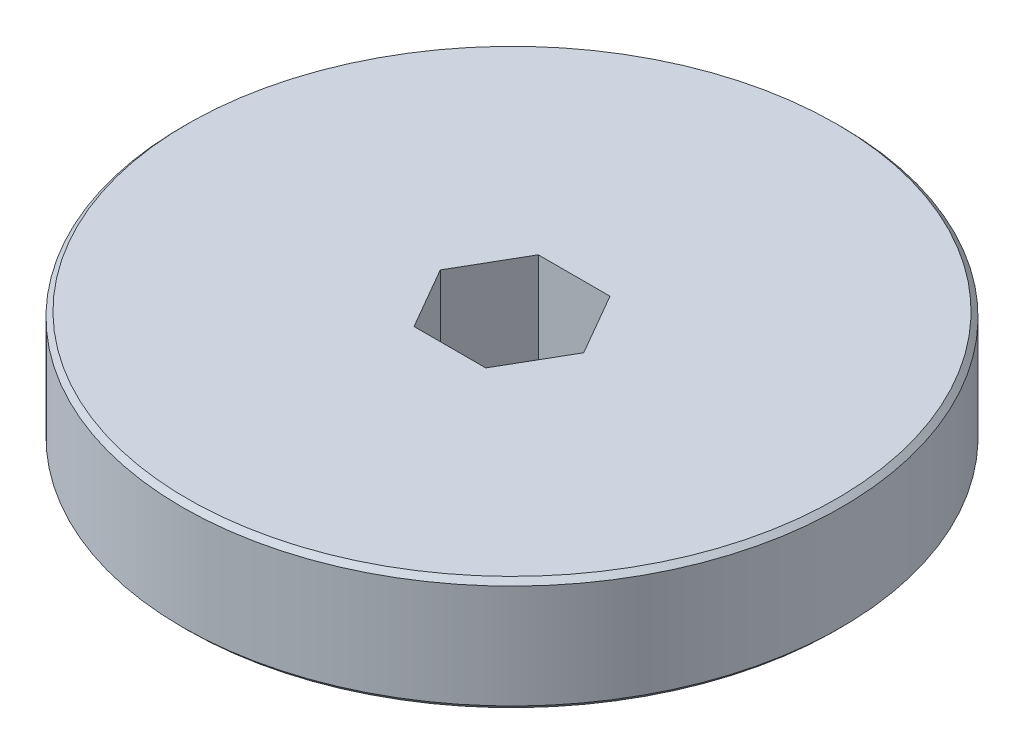
ISO-10303-21;
HEADER;
FILE_DESCRIPTION(('STEP AP214'),'2;1');
FILE_NAME('part.step','',(''),(''),'','','');
FILE_SCHEMA(('AUTOMOTIVE_DESIGN { 1 0 10303 214 1 1 1 1 }'));
ENDSEC;
DATA;
#1=APPLICATION_CONTEXT('core data for automotive mechanical design processes');
#2=APPLICATION_PROTOCOL_DEFINITION('international standard','automotive_design',2000,#1);
#3=PRODUCT_CONTEXT('',#1,'mechanical');
#4=PRODUCT('Part','Part','',(#3));
#5=PRODUCT_RELATED_PRODUCT_CATEGORY('part','',(#4));
#6=PRODUCT_DEFINITION_FORMATION('','',#4);
#7=PRODUCT_DEFINITION_CONTEXT('part definition',#1,'design');
#8=PRODUCT_DEFINITION('design','',#6,#7);
#9=PRODUCT_DEFINITION_SHAPE('','',#8);
#10=(LENGTH_UNIT() NAMED_UNIT(*) SI_UNIT(.MILLI.,.METRE.));
#11=(NAMED_UNIT(*) PLANE_ANGLE_UNIT() SI_UNIT($,.RADIAN.));
#12=(NAMED_UNIT(*) SI_UNIT($,.STERADIAN.) SOLID_ANGLE_UNIT());
#13=UNCERTAINTY_MEASURE_WITH_UNIT(LENGTH_MEASURE(1.E-05),#10,'distance_accuracy_value','');
#14=(GEOMETRIC_REPRESENTATION_CONTEXT(3) GLOBAL_UNCERTAINTY_ASSIGNED_CONTEXT((#13)) GLOBAL_UNIT_ASSIGNED_CONTEXT((#10,
#11,#12)) REPRESENTATION_CONTEXT('',''));
#15=CARTESIAN_POINT('',(0.,0.,0.));
#16=DIRECTION('',(0.,0.,1.));
#17=DIRECTION('',(1.,0.,0.));
#18=AXIS2_PLACEMENT_3D('',#15,#16,#17);
#19=CARTESIAN_POINT('',(0.,-0.381,0.));
#20=DIRECTION('',(0.,-1.,0.));
#21=DIRECTION('',(0.,0.,-1.));
#22=AXIS2_PLACEMENT_3D('',#19,#20,#21);
#23=CONICAL_SURFACE('',#22,25.4,0.785398163397447);
#24=CARTESIAN_POINT('',(0.,0.,0.));
#25=DIRECTION('',(0.,-1.,0.));
#26=DIRECTION('',(0.,0.,-1.));
#27=AXIS2_PLACEMENT_3D('',#24,#25,#26);
#28=CIRCLE('',#27,25.019);
#29=CARTESIAN_POINT('',(0.,0.,-25.019));
#30=VERTEX_POINT('',#29);
#31=EDGE_CURVE('E20',#30,#30,#28,.F.);
#32=ORIENTED_EDGE('',*,*,#31,.F.);
#33=EDGE_LOOP('',(#32));
#34=FACE_BOUND('',#33,.T.);
#35=CARTESIAN_POINT('',(0.,-0.380999999999999,0.));
#36=DIRECTION('',(0.,-1.,0.));
#37=DIRECTION('',(0.,0.,-1.));
#38=AXIS2_PLACEMENT_3D('',#35,#36,#37);
#39=CIRCLE('',#38,25.4);
#40=CARTESIAN_POINT('',(0.,-0.380999999999999,-25.4));
#41=VERTEX_POINT('',#40);
#42=EDGE_CURVE('E103',#41,#41,#39,.T.);
#43=ORIENTED_EDGE('',*,*,#42,.F.);
#44=EDGE_LOOP('',(#43));
#45=FACE_BOUND('',#44,.T.);
#46=ADVANCED_FACE('F17',(#34,#45),#23,.T.);
#47=CARTESIAN_POINT('',(0.,-8.763,0.));
#48=DIRECTION('',(0.,-1.,0.));
#49=DIRECTION('',(0.,0.,-1.));
#50=AXIS2_PLACEMENT_3D('',#47,#48,#49);
#51=CYLINDRICAL_SURFACE('',#50,25.4);
#52=CARTESIAN_POINT('',(0.,-8.382,0.));
#53=DIRECTION('',(0.,1.,0.));
#54=DIRECTION('',(0.,0.,1.));
#55=AXIS2_PLACEMENT_3D('',#52,#53,#54);
#56=CIRCLE('',#55,25.4);
#57=CARTESIAN_POINT('',(0.,-8.382,25.4));
#58=VERTEX_POINT('',#57);
#59=EDGE_CURVE('E90',#58,#58,#56,.F.);
#60=ORIENTED_EDGE('',*,*,#59,.F.);
#61=EDGE_LOOP('',(#60));
#62=FACE_BOUND('',#61,.T.);
#63=ORIENTED_EDGE('',*,*,#42,.T.);
#64=EDGE_LOOP('',(#63));
#65=FACE_BOUND('',#64,.T.);
#66=ADVANCED_FACE('F207',(#62,#65),#51,.T.);
#67=CARTESIAN_POINT('',(0.,0.,0.));
#68=DIRECTION('',(0.,1.,0.));
#69=DIRECTION('',(0.,0.,1.));
#70=AXIS2_PLACEMENT_3D('',#67,#68,#69);
#71=PLANE('',#70);
#72=DIRECTION('',(0.499999999999999,0.,0.866025403784439));
#73=VECTOR('',#72,1.);
#74=CARTESIAN_POINT('',(5.52859070770601,0.,0.));
#75=LINE('',#74,#73);
#76=CARTESIAN_POINT('',(5.52859070770601,0.,0.));
#77=VERTEX_POINT('',#76);
#78=CARTESIAN_POINT('',(2.764295353853,0.,-4.78789999999999));
#79=VERTEX_POINT('',#78);
#80=EDGE_CURVE('E66',#77,#79,#75,.F.);
#81=ORIENTED_EDGE('',*,*,#80,.F.);
#82=DIRECTION('',(-0.5,0.,0.866025403784439));
#83=VECTOR('',#82,1.);
#84=CARTESIAN_POINT('',(2.764295353853,0.,4.78790000000001));
#85=LINE('',#84,#83);
#86=CARTESIAN_POINT('',(2.764295353853,0.,4.78790000000001));
#87=VERTEX_POINT('',#86);
#88=EDGE_CURVE('E125',#87,#77,#85,.F.);
#89=ORIENTED_EDGE('',*,*,#88,.F.);
#90=DIRECTION('',(-1.,0.,0.));
#91=VECTOR('',#90,1.);
#92=CARTESIAN_POINT('',(-2.76429535385301,0.,4.78790000000001));
#93=LINE('',#92,#91);
#94=CARTESIAN_POINT('',(-2.76429535385301,0.,4.78790000000001));
#95=VERTEX_POINT('',#94);
#96=EDGE_CURVE('E121',#95,#87,#93,.F.);
#97=ORIENTED_EDGE('',*,*,#96,.F.);
#98=DIRECTION('',(-0.5,0.,-0.866025403784439));
#99=VECTOR('',#98,1.);
#100=CARTESIAN_POINT('',(-5.52859070770602,0.,0.));
#101=LINE('',#100,#99);
#102=CARTESIAN_POINT('',(-5.52859070770602,0.,0.));
#103=VERTEX_POINT('',#102);
#104=EDGE_CURVE('E86',#103,#95,#101,.F.);
#105=ORIENTED_EDGE('',*,*,#104,.F.);
#106=DIRECTION('',(0.5,0.,-0.866025403784439));
#107=VECTOR('',#106,1.);
#108=CARTESIAN_POINT('',(-2.76429535385301,0.,-4.78789999999999));
#109=LINE('',#108,#107);
#110=CARTESIAN_POINT('',(-2.76429535385301,0.,-4.78789999999999));
#111=VERTEX_POINT('',#110);
#112=EDGE_CURVE('E80',#111,#103,#109,.F.);
#113=ORIENTED_EDGE('',*,*,#112,.F.);
#114=DIRECTION('',(1.,0.,0.));
#115=VECTOR('',#114,1.);
#116=CARTESIAN_POINT('',(2.764295353853,0.,-4.78789999999999));
#117=LINE('',#116,#115);
#118=EDGE_CURVE('E71',#79,#111,#117,.F.);
#119=ORIENTED_EDGE('',*,*,#118,.F.);
#120=EDGE_LOOP('',(#81,#89,#97,#105,#113,#119));
#121=FACE_BOUND('',#120,.T.);
#122=ORIENTED_EDGE('',*,*,#31,.T.);
#123=EDGE_LOOP('',(#122));
#124=FACE_BOUND('',#123,.T.);
#125=ADVANCED_FACE('F83',(#121,#124),#71,.T.);
#126=CARTESIAN_POINT('',(0.,-8.382,0.));
#127=DIRECTION('',(0.,1.,0.));
#128=DIRECTION('',(0.,0.,1.));
#129=AXIS2_PLACEMENT_3D('',#126,#127,#128);
#130=CONICAL_SURFACE('',#129,25.4,0.785398163397446);
#131=ORIENTED_EDGE('',*,*,#59,.T.);
#132=EDGE_LOOP('',(#131));
#133=FACE_BOUND('',#132,.T.);
#134=CARTESIAN_POINT('',(0.,-8.763,0.));
#135=DIRECTION('',(0.,1.,0.));
#136=DIRECTION('',(0.,0.,1.));
#137=AXIS2_PLACEMENT_3D('',#134,#135,#136);
#138=CIRCLE('',#137,25.019);
#139=CARTESIAN_POINT('',(0.,-8.763,25.019));
#140=VERTEX_POINT('',#139);
#141=EDGE_CURVE('E107',#140,#140,#138,.T.);
#142=ORIENTED_EDGE('',*,*,#141,.T.);
#143=EDGE_LOOP('',(#142));
#144=FACE_BOUND('',#143,.T.);
#145=ADVANCED_FACE('F193',(#133,#144),#130,.T.);
#146=CARTESIAN_POINT('',(-2.76429535385301,62.9457225367596,-4.78789999999999));
#147=DIRECTION('',(0.866025403784439,0.,0.5));
#148=DIRECTION('',(0.5,0.,-0.866025403784439));
#149=AXIS2_PLACEMENT_3D('',#146,#147,#148);
#150=PLANE('',#149);
#151=ORIENTED_EDGE('',*,*,#112,.T.);
#152=DIRECTION('',(0.,1.,0.));
#153=VECTOR('',#152,1.);
#154=CARTESIAN_POINT('',(-5.52859070770602,62.9457225367596,0.));
#155=LINE('',#154,#153);
#156=CARTESIAN_POINT('',(-5.52859070770602,-8.76300000000003,0.));
#157=VERTEX_POINT('',#156);
#158=EDGE_CURVE('E114',#157,#103,#155,.T.);
#159=ORIENTED_EDGE('',*,*,#158,.F.);
#160=DIRECTION('',(0.5,0.,-0.866025403784438));
#161=VECTOR('',#160,1.);
#162=CARTESIAN_POINT('',(-5.52859070770602,-8.763,0.));
#163=LINE('',#162,#161);
#164=CARTESIAN_POINT('',(-2.76429535385301,-8.76300000000002,-4.78789999999999));
#165=VERTEX_POINT('',#164);
#166=EDGE_CURVE('E94',#157,#165,#163,.T.);
#167=ORIENTED_EDGE('',*,*,#166,.T.);
#168=DIRECTION('',(0.,1.,0.));
#169=VECTOR('',#168,1.);
#170=CARTESIAN_POINT('',(-2.76429535385301,62.9457225367596,-4.78789999999999));
#171=LINE('',#170,#169);
#172=EDGE_CURVE('E76',#111,#165,#171,.F.);
#173=ORIENTED_EDGE('',*,*,#172,.F.);
#174=EDGE_LOOP('',(#151,#159,#167,#173));
#175=FACE_BOUND('',#174,.T.);
#176=ADVANCED_FACE('F93',(#175),#150,.T.);
#177=CARTESIAN_POINT('',(2.764295353853,62.9457225367596,-4.78789999999999));
#178=DIRECTION('',(0.,0.,1.));
#179=DIRECTION('',(1.,0.,0.));
#180=AXIS2_PLACEMENT_3D('',#177,#178,#179);
#181=PLANE('',#180);
#182=ORIENTED_EDGE('',*,*,#118,.T.);
#183=ORIENTED_EDGE('',*,*,#172,.T.);
#184=DIRECTION('',(1.,0.,0.));
#185=VECTOR('',#184,1.);
#186=CARTESIAN_POINT('',(0.,-8.763,-4.78789999999999));
#187=LINE('',#186,#185);
#188=CARTESIAN_POINT('',(2.764295353853,-8.76300000000001,-4.78789999999999));
#189=VERTEX_POINT('',#188);
#190=EDGE_CURVE('E111',#165,#189,#187,.T.);
#191=ORIENTED_EDGE('',*,*,#190,.T.);
#192=DIRECTION('',(0.,1.,0.));
#193=VECTOR('',#192,1.);
#194=CARTESIAN_POINT('',(2.764295353853,62.9457225367596,-4.7879));
#195=LINE('',#194,#193);
#196=EDGE_CURVE('E78',#79,#189,#195,.F.);
#197=ORIENTED_EDGE('',*,*,#196,.F.);
#198=EDGE_LOOP('',(#182,#183,#191,#197));
#199=FACE_BOUND('',#198,.T.);
#200=ADVANCED_FACE('F73',(#199),#181,.T.);
#201=CARTESIAN_POINT('',(5.52859070770601,62.9457225367596,0.));
#202=DIRECTION('',(-0.866025403784439,0.,0.499999999999999));
#203=DIRECTION('',(0.499999999999999,0.,0.866025403784439));
#204=AXIS2_PLACEMENT_3D('',#201,#202,#203);
#205=PLANE('',#204);
#206=ORIENTED_EDGE('',*,*,#80,.T.);
#207=ORIENTED_EDGE('',*,*,#196,.T.);
#208=DIRECTION('',(0.499999999999999,0.,0.866025403784439));
#209=VECTOR('',#208,1.);
#210=CARTESIAN_POINT('',(2.764295353853,-8.763,-4.7879));
#211=LINE('',#210,#209);
#212=CARTESIAN_POINT('',(5.52859070770601,-8.76300000000003,0.));
#213=VERTEX_POINT('',#212);
#214=EDGE_CURVE('E129',#189,#213,#211,.T.);
#215=ORIENTED_EDGE('',*,*,#214,.T.);
#216=DIRECTION('',(0.,1.,0.));
#217=VECTOR('',#216,1.);
#218=CARTESIAN_POINT('',(5.52859070770601,62.9457225367596,0.));
#219=LINE('',#218,#217);
#220=EDGE_CURVE('E123',#77,#213,#219,.F.);
#221=ORIENTED_EDGE('',*,*,#220,.F.);
#222=EDGE_LOOP('',(#206,#207,#215,#221));
#223=FACE_BOUND('',#222,.T.);
#224=ADVANCED_FACE('F128',(#223),#205,.T.);
#225=CARTESIAN_POINT('',(2.764295353853,62.9457225367596,4.78790000000001));
#226=DIRECTION('',(-0.866025403784439,0.,-0.5));
#227=DIRECTION('',(-0.5,0.,0.866025403784439));
#228=AXIS2_PLACEMENT_3D('',#225,#226,#227);
#229=PLANE('',#228);
#230=ORIENTED_EDGE('',*,*,#88,.T.);
#231=ORIENTED_EDGE('',*,*,#220,.T.);
#232=DIRECTION('',(-0.5,0.,0.866025403784439));
#233=VECTOR('',#232,1.);
#234=CARTESIAN_POINT('',(5.52859070770601,-8.763,0.));
#235=LINE('',#234,#233);
#236=CARTESIAN_POINT('',(2.764295353853,-8.76300000000002,4.78790000000001));
#237=VERTEX_POINT('',#236);
#238=EDGE_CURVE('E136',#213,#237,#235,.T.);
#239=ORIENTED_EDGE('',*,*,#238,.T.);
#240=DIRECTION('',(0.,1.,0.));
#241=VECTOR('',#240,1.);
#242=CARTESIAN_POINT('',(2.764295353853,62.9457225367596,4.78790000000001));
#243=LINE('',#242,#241);
#244=EDGE_CURVE('E119',#87,#237,#243,.F.);
#245=ORIENTED_EDGE('',*,*,#244,.F.);
#246=EDGE_LOOP('',(#230,#231,#239,#245));
#247=FACE_BOUND('',#246,.T.);
#248=ADVANCED_FACE('F145',(#247),#229,.T.);
#249=CARTESIAN_POINT('',(-2.76429535385301,62.9457225367596,4.78790000000001));
#250=DIRECTION('',(0.,0.,-1.));
#251=DIRECTION('',(-1.,0.,0.));
#252=AXIS2_PLACEMENT_3D('',#249,#250,#251);
#253=PLANE('',#252);
#254=ORIENTED_EDGE('',*,*,#96,.T.);
#255=ORIENTED_EDGE('',*,*,#244,.T.);
#256=DIRECTION('',(1.,0.,0.));
#257=VECTOR('',#256,1.);
#258=CARTESIAN_POINT('',(0.,-8.763,4.78790000000001));
#259=LINE('',#258,#257);
#260=CARTESIAN_POINT('',(-2.76429535385301,-8.76300000000001,4.78790000000001));
#261=VERTEX_POINT('',#260);
#262=EDGE_CURVE('E26',#237,#261,#259,.F.);
#263=ORIENTED_EDGE('',*,*,#262,.T.);
#264=DIRECTION('',(0.,1.,0.));
#265=VECTOR('',#264,1.);
#266=CARTESIAN_POINT('',(-2.76429535385301,62.9457225367596,4.78790000000001));
#267=LINE('',#266,#265);
#268=EDGE_CURVE('E34',#95,#261,#267,.F.);
#269=ORIENTED_EDGE('',*,*,#268,.F.);
#270=EDGE_LOOP('',(#254,#255,#263,#269));
#271=FACE_BOUND('',#270,.T.);
#272=ADVANCED_FACE('F142',(#271),#253,.T.);
#273=CARTESIAN_POINT('',(-5.52859070770602,62.9457225367596,0.));
#274=DIRECTION('',(0.866025403784439,0.,-0.5));
#275=DIRECTION('',(-0.5,0.,-0.866025403784439));
#276=AXIS2_PLACEMENT_3D('',#273,#274,#275);
#277=PLANE('',#276);
#278=ORIENTED_EDGE('',*,*,#104,.T.);
#279=ORIENTED_EDGE('',*,*,#268,.T.);
#280=DIRECTION('',(-0.5,0.,-0.866025403784439));
#281=VECTOR('',#280,1.);
#282=CARTESIAN_POINT('',(-2.76429535385301,-8.763,4.78790000000001));
#283=LINE('',#282,#281);
#284=EDGE_CURVE('E11',#261,#157,#283,.T.);
#285=ORIENTED_EDGE('',*,*,#284,.T.);
#286=ORIENTED_EDGE('',*,*,#158,.T.);
#287=EDGE_LOOP('',(#278,#279,#285,#286));
#288=FACE_BOUND('',#287,.T.);
#289=ADVANCED_FACE('F154',(#288),#277,.T.);
#290=CARTESIAN_POINT('',(0.,-8.763,0.));
#291=DIRECTION('',(0.,1.,0.));
#292=DIRECTION('',(0.,0.,1.));
#293=AXIS2_PLACEMENT_3D('',#290,#291,#292);
#294=PLANE('',#293);
#295=ORIENTED_EDGE('',*,*,#262,.F.);
#296=ORIENTED_EDGE('',*,*,#238,.F.);
#297=ORIENTED_EDGE('',*,*,#214,.F.);
#298=ORIENTED_EDGE('',*,*,#190,.F.);
#299=ORIENTED_EDGE('',*,*,#166,.F.);
#300=ORIENTED_EDGE('',*,*,#284,.F.);
#301=EDGE_LOOP('',(#295,#296,#297,#298,#299,#300));
#302=FACE_BOUND('',#301,.T.);
#303=ORIENTED_EDGE('',*,*,#141,.F.);
#304=EDGE_LOOP('',(#303));
#305=FACE_BOUND('',#304,.T.);
#306=ADVANCED_FACE('F133',(#302,#305),#294,.F.);
#307=CLOSED_SHELL('',(#46,#66,#125,#145,#176,#200,#224,#248,#272,#289,#306));
#308=MANIFOLD_SOLID_BREP('B1',#307);
#309=ADVANCED_BREP_SHAPE_REPRESENTATION('',(#18,#308),#14);
#310=SHAPE_DEFINITION_REPRESENTATION(#9,#309);
ENDSEC;
END-ISO-10303-21;
